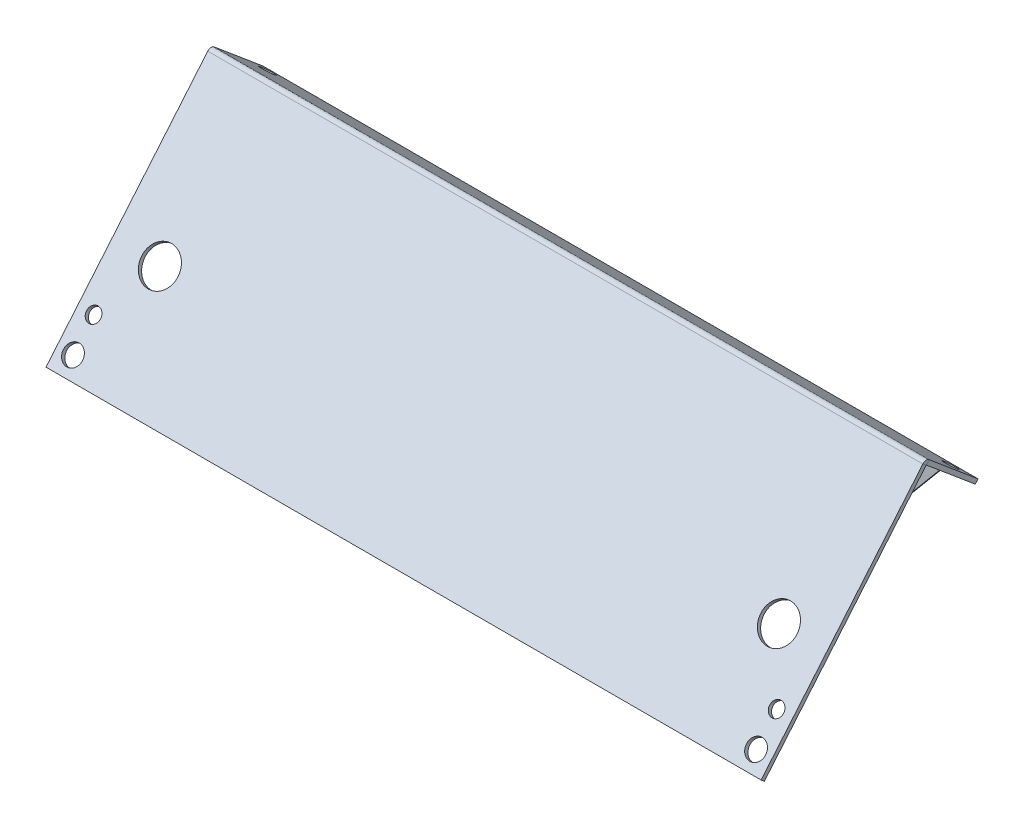
ISO-10303-21;
HEADER;
FILE_DESCRIPTION(('STEP AP214'),'2;1');
FILE_NAME('part.step','',(''),(''),'','','');
FILE_SCHEMA(('AUTOMOTIVE_DESIGN { 1 0 10303 214 1 1 1 1 }'));
ENDSEC;
DATA;
#1=APPLICATION_CONTEXT('core data for automotive mechanical design processes');
#2=APPLICATION_PROTOCOL_DEFINITION('international standard','automotive_design',2000,#1);
#3=PRODUCT_CONTEXT('',#1,'mechanical');
#4=PRODUCT('Part','Part','',(#3));
#5=PRODUCT_RELATED_PRODUCT_CATEGORY('part','',(#4));
#6=PRODUCT_DEFINITION_FORMATION('','',#4);
#7=PRODUCT_DEFINITION_CONTEXT('part definition',#1,'design');
#8=PRODUCT_DEFINITION('design','',#6,#7);
#9=PRODUCT_DEFINITION_SHAPE('','',#8);
#10=(LENGTH_UNIT() NAMED_UNIT(*) SI_UNIT(.MILLI.,.METRE.));
#11=(NAMED_UNIT(*) PLANE_ANGLE_UNIT() SI_UNIT($,.RADIAN.));
#12=(NAMED_UNIT(*) SI_UNIT($,.STERADIAN.) SOLID_ANGLE_UNIT());
#13=UNCERTAINTY_MEASURE_WITH_UNIT(LENGTH_MEASURE(1.E-05),#10,'distance_accuracy_value','');
#14=(GEOMETRIC_REPRESENTATION_CONTEXT(3) GLOBAL_UNCERTAINTY_ASSIGNED_CONTEXT((#13)) GLOBAL_UNIT_ASSIGNED_CONTEXT((#10,
#11,#12)) REPRESENTATION_CONTEXT('',''));
#15=CARTESIAN_POINT('',(0.,0.,0.));
#16=DIRECTION('',(0.,0.,1.));
#17=DIRECTION('',(1.,0.,0.));
#18=AXIS2_PLACEMENT_3D('',#15,#16,#17);
#19=CARTESIAN_POINT('',(-167.5,16.,2.));
#20=DIRECTION('',(0.,0.,-1.));
#21=DIRECTION('',(-1.,0.,0.));
#22=AXIS2_PLACEMENT_3D('',#19,#20,#21);
#23=PLANE('',#22);
#24=CARTESIAN_POINT('',(105.,-5.99999999999999,2.));
#25=DIRECTION('',(0.,0.,-1.));
#26=DIRECTION('',(-1.,0.,0.));
#27=AXIS2_PLACEMENT_3D('',#24,#25,#26);
#28=CIRCLE('',#27,3.);
#29=CARTESIAN_POINT('',(102.,-5.99999999999999,2.));
#30=VERTEX_POINT('',#29);
#31=EDGE_CURVE('E226',#30,#30,#28,.T.);
#32=ORIENTED_EDGE('',*,*,#31,.T.);
#33=EDGE_LOOP('',(#32));
#34=FACE_BOUND('',#33,.T.);
#35=CARTESIAN_POINT('',(35.,-5.99999999999999,2.));
#36=DIRECTION('',(0.,0.,-1.));
#37=DIRECTION('',(-1.,0.,0.));
#38=AXIS2_PLACEMENT_3D('',#35,#36,#37);
#39=CIRCLE('',#38,3.);
#40=CARTESIAN_POINT('',(32.,-5.99999999999999,2.));
#41=VERTEX_POINT('',#40);
#42=EDGE_CURVE('E220',#41,#41,#39,.T.);
#43=ORIENTED_EDGE('',*,*,#42,.T.);
#44=EDGE_LOOP('',(#43));
#45=FACE_BOUND('',#44,.T.);
#46=CARTESIAN_POINT('',(-35.,-5.99999999999999,2.));
#47=DIRECTION('',(0.,0.,-1.));
#48=DIRECTION('',(-1.,0.,0.));
#49=AXIS2_PLACEMENT_3D('',#46,#47,#48);
#50=CIRCLE('',#49,3.);
#51=CARTESIAN_POINT('',(-38.,-5.99999999999999,2.));
#52=VERTEX_POINT('',#51);
#53=EDGE_CURVE('E214',#52,#52,#50,.T.);
#54=ORIENTED_EDGE('',*,*,#53,.T.);
#55=EDGE_LOOP('',(#54));
#56=FACE_BOUND('',#55,.T.);
#57=CARTESIAN_POINT('',(-105.,-5.99999999999999,2.));
#58=DIRECTION('',(0.,0.,-1.));
#59=DIRECTION('',(-1.,0.,0.));
#60=AXIS2_PLACEMENT_3D('',#57,#58,#59);
#61=CIRCLE('',#60,3.);
#62=CARTESIAN_POINT('',(-108.,-5.99999999999999,2.));
#63=VERTEX_POINT('',#62);
#64=EDGE_CURVE('E208',#63,#63,#61,.T.);
#65=ORIENTED_EDGE('',*,*,#64,.T.);
#66=EDGE_LOOP('',(#65));
#67=FACE_BOUND('',#66,.T.);
#68=DIRECTION('',(-0.642787609686543,0.766044443118974,0.));
#69=VECTOR('',#68,1.);
#70=CARTESIAN_POINT('',(-153.,16.0299736784964,2.));
#71=LINE('',#70,#69);
#72=CARTESIAN_POINT('',(-126.123660899755,-16.,2.));
#73=VERTEX_POINT('',#72);
#74=CARTESIAN_POINT('',(-152.935721239031,15.9533692341845,2.));
#75=VERTEX_POINT('',#74);
#76=EDGE_CURVE('E746',#73,#75,#71,.T.);
#77=ORIENTED_EDGE('',*,*,#76,.F.);
#78=DIRECTION('',(1.,0.,0.));
#79=VECTOR('',#78,1.);
#80=CARTESIAN_POINT('',(-167.5,-16.,2.));
#81=LINE('',#80,#79);
#82=CARTESIAN_POINT('',(126.123660899755,-16.,2.));
#83=VERTEX_POINT('',#82);
#84=EDGE_CURVE('E14',#73,#83,#81,.T.);
#85=ORIENTED_EDGE('',*,*,#84,.T.);
#86=DIRECTION('',(0.642787609686543,0.766044443118974,0.));
#87=VECTOR('',#86,1.);
#88=CARTESIAN_POINT('',(153.,16.0299736784964,2.));
#89=LINE('',#88,#87);
#90=CARTESIAN_POINT('',(152.935721239031,15.9533692341845,2.));
#91=VERTEX_POINT('',#90);
#92=EDGE_CURVE('E754',#83,#91,#89,.T.);
#93=ORIENTED_EDGE('',*,*,#92,.T.);
#94=DIRECTION('',(-1.,0.,0.));
#95=VECTOR('',#94,1.);
#96=CARTESIAN_POINT('',(-167.5,15.9533692341845,2.));
#97=LINE('',#96,#95);
#98=EDGE_CURVE('E199',#75,#91,#97,.F.);
#99=ORIENTED_EDGE('',*,*,#98,.F.);
#100=EDGE_LOOP('',(#77,#85,#93,#99));
#101=FACE_BOUND('',#100,.T.);
#102=ADVANCED_FACE('F52',(#34,#45,#56,#67,#101),#23,.F.);
#103=CARTESIAN_POINT('',(-167.5,16.,0.));
#104=DIRECTION('',(0.,0.,-1.));
#105=DIRECTION('',(-1.,0.,0.));
#106=AXIS2_PLACEMENT_3D('',#103,#104,#105);
#107=PLANE('',#106);
#108=CARTESIAN_POINT('',(-105.,-5.99999999999999,0.));
#109=DIRECTION('',(0.,0.,-1.));
#110=DIRECTION('',(-1.,0.,0.));
#111=AXIS2_PLACEMENT_3D('',#108,#109,#110);
#112=CIRCLE('',#111,3.);
#113=CARTESIAN_POINT('',(-108.,-5.99999999999999,0.));
#114=VERTEX_POINT('',#113);
#115=EDGE_CURVE('E204',#114,#114,#112,.T.);
#116=ORIENTED_EDGE('',*,*,#115,.F.);
#117=EDGE_LOOP('',(#116));
#118=FACE_BOUND('',#117,.T.);
#119=CARTESIAN_POINT('',(-35.,-5.99999999999999,0.));
#120=DIRECTION('',(0.,0.,-1.));
#121=DIRECTION('',(-1.,0.,0.));
#122=AXIS2_PLACEMENT_3D('',#119,#120,#121);
#123=CIRCLE('',#122,3.);
#124=CARTESIAN_POINT('',(-38.,-5.99999999999999,0.));
#125=VERTEX_POINT('',#124);
#126=EDGE_CURVE('E211',#125,#125,#123,.T.);
#127=ORIENTED_EDGE('',*,*,#126,.F.);
#128=EDGE_LOOP('',(#127));
#129=FACE_BOUND('',#128,.T.);
#130=CARTESIAN_POINT('',(35.,-5.99999999999999,0.));
#131=DIRECTION('',(0.,0.,-1.));
#132=DIRECTION('',(-1.,0.,0.));
#133=AXIS2_PLACEMENT_3D('',#130,#131,#132);
#134=CIRCLE('',#133,3.);
#135=CARTESIAN_POINT('',(32.,-5.99999999999999,0.));
#136=VERTEX_POINT('',#135);
#137=EDGE_CURVE('E217',#136,#136,#134,.T.);
#138=ORIENTED_EDGE('',*,*,#137,.F.);
#139=EDGE_LOOP('',(#138));
#140=FACE_BOUND('',#139,.T.);
#141=CARTESIAN_POINT('',(105.,-5.99999999999999,0.));
#142=DIRECTION('',(0.,0.,-1.));
#143=DIRECTION('',(-1.,0.,0.));
#144=AXIS2_PLACEMENT_3D('',#141,#142,#143);
#145=CIRCLE('',#144,3.);
#146=CARTESIAN_POINT('',(102.,-5.99999999999999,0.));
#147=VERTEX_POINT('',#146);
#148=EDGE_CURVE('E223',#147,#147,#145,.T.);
#149=ORIENTED_EDGE('',*,*,#148,.F.);
#150=EDGE_LOOP('',(#149));
#151=FACE_BOUND('',#150,.T.);
#152=DIRECTION('',(1.,0.,0.));
#153=VECTOR('',#152,1.);
#154=CARTESIAN_POINT('',(-167.5,-16.,0.));
#155=LINE('',#154,#153);
#156=CARTESIAN_POINT('',(-126.123660899755,-16.,0.));
#157=VERTEX_POINT('',#156);
#158=CARTESIAN_POINT('',(126.123660899755,-16.,0.));
#159=VERTEX_POINT('',#158);
#160=EDGE_CURVE('E61',#157,#159,#155,.T.);
#161=ORIENTED_EDGE('',*,*,#160,.F.);
#162=DIRECTION('',(-0.642787609686543,0.766044443118974,0.));
#163=VECTOR('',#162,1.);
#164=CARTESIAN_POINT('',(-153.,16.0299736784964,0.));
#165=LINE('',#164,#163);
#166=CARTESIAN_POINT('',(-152.935721239031,15.9533692341845,0.));
#167=VERTEX_POINT('',#166);
#168=EDGE_CURVE('E175',#157,#167,#165,.T.);
#169=ORIENTED_EDGE('',*,*,#168,.T.);
#170=DIRECTION('',(-1.,0.,0.));
#171=VECTOR('',#170,1.);
#172=CARTESIAN_POINT('',(-167.5,15.9533692341845,0.));
#173=LINE('',#172,#171);
#174=CARTESIAN_POINT('',(152.935721239031,15.9533692341845,0.));
#175=VERTEX_POINT('',#174);
#176=EDGE_CURVE('E174',#167,#175,#173,.F.);
#177=ORIENTED_EDGE('',*,*,#176,.T.);
#178=DIRECTION('',(0.642787609686543,0.766044443118974,0.));
#179=VECTOR('',#178,1.);
#180=CARTESIAN_POINT('',(153.,16.0299736784964,0.));
#181=LINE('',#180,#179);
#182=EDGE_CURVE('E751',#159,#175,#181,.T.);
#183=ORIENTED_EDGE('',*,*,#182,.F.);
#184=EDGE_LOOP('',(#161,#169,#177,#183));
#185=FACE_BOUND('',#184,.T.);
#186=ADVANCED_FACE('F357',(#118,#129,#140,#151,#185),#107,.T.);
#187=CARTESIAN_POINT('',(-167.5,-16.,2.));
#188=DIRECTION('',(0.,1.,0.));
#189=DIRECTION('',(0.,0.,1.));
#190=AXIS2_PLACEMENT_3D('',#187,#188,#189);
#191=PLANE('',#190);
#192=DIRECTION('',(0.,0.,-1.));
#193=VECTOR('',#192,1.);
#194=CARTESIAN_POINT('',(-126.123660899755,-16.,0.));
#195=LINE('',#194,#193);
#196=EDGE_CURVE('E740',#157,#73,#195,.F.);
#197=ORIENTED_EDGE('',*,*,#196,.F.);
#198=ORIENTED_EDGE('',*,*,#160,.T.);
#199=DIRECTION('',(0.,0.,-1.));
#200=VECTOR('',#199,1.);
#201=CARTESIAN_POINT('',(126.123660899755,-16.,0.));
#202=LINE('',#201,#200);
#203=EDGE_CURVE('E758',#159,#83,#202,.F.);
#204=ORIENTED_EDGE('',*,*,#203,.T.);
#205=ORIENTED_EDGE('',*,*,#84,.F.);
#206=EDGE_LOOP('',(#197,#198,#204,#205));
#207=FACE_BOUND('',#206,.T.);
#208=ADVANCED_FACE('F54',(#207),#191,.F.);
#209=CARTESIAN_POINT('',(-167.5,15.9533692341845,2.1));
#210=DIRECTION('',(-1.,0.,0.));
#211=DIRECTION('',(0.,0.766044443118974,-0.642787609686543));
#212=AXIS2_PLACEMENT_3D('',#209,#210,#211);
#213=CYLINDRICAL_SURFACE('',#212,2.1);
#214=ORIENTED_EDGE('',*,*,#176,.F.);
#215=CARTESIAN_POINT('',(-152.935721239031,15.9533692341845,2.1));
#216=DIRECTION('',(-0.999202668689739,-0.0399252662270862,0.));
#217=DIRECTION('',(-0.0399252662270862,0.999202668689739,0.));
#218=AXIS2_PLACEMENT_3D('',#215,#216,#217);
#219=ELLIPSE('',#218,2.10167573186503,2.1);
#220=CARTESIAN_POINT('',(-153.,17.5620625647344,0.75014601965826));
#221=VERTEX_POINT('',#220);
#222=EDGE_CURVE('E158',#167,#221,#219,.F.);
#223=ORIENTED_EDGE('',*,*,#222,.T.);
#224=DIRECTION('',(1.,0.,0.));
#225=VECTOR('',#224,1.);
#226=CARTESIAN_POINT('',(0.,17.5620625647344,0.750146019658253));
#227=LINE('',#226,#225);
#228=CARTESIAN_POINT('',(153.,17.5620625647344,0.750146019658247));
#229=VERTEX_POINT('',#228);
#230=EDGE_CURVE('E172',#221,#229,#227,.T.);
#231=ORIENTED_EDGE('',*,*,#230,.T.);
#232=CARTESIAN_POINT('',(152.935721239031,15.9533692341845,2.1));
#233=DIRECTION('',(-0.999202668689749,0.0399252662268225,0.));
#234=DIRECTION('',(-0.0399252662268225,-0.999202668689749,0.));
#235=AXIS2_PLACEMENT_3D('',#232,#233,#234);
#236=ELLIPSE('',#235,2.10167573186501,2.1);
#237=EDGE_CURVE('E755',#175,#229,#236,.F.);
#238=ORIENTED_EDGE('',*,*,#237,.F.);
#239=EDGE_LOOP('',(#214,#223,#231,#238));
#240=FACE_BOUND('',#239,.T.);
#241=ADVANCED_FACE('F169',(#240),#213,.T.);
#242=CARTESIAN_POINT('',(-167.5,15.9533692341845,2.1));
#243=DIRECTION('',(-1.,0.,0.));
#244=DIRECTION('',(0.,0.766044443118974,-0.642787609686543));
#245=AXIS2_PLACEMENT_3D('',#242,#243,#244);
#246=CYLINDRICAL_SURFACE('',#245,0.100000000000001);
#247=CARTESIAN_POINT('',(-152.935721239031,15.9533692341845,2.1));
#248=DIRECTION('',(-0.766044443118974,-0.642787609686543,0.));
#249=DIRECTION('',(-0.642787609686544,0.766044443118975,0.));
#250=AXIS2_PLACEMENT_3D('',#247,#248,#249);
#251=ELLIPSE('',#250,0.13054072893323,0.100000000000001);
#252=CARTESIAN_POINT('',(-153.,16.0299736784964,2.03572123903135));
#253=VERTEX_POINT('',#252);
#254=EDGE_CURVE('E69',#75,#253,#251,.F.);
#255=ORIENTED_EDGE('',*,*,#254,.F.);
#256=ORIENTED_EDGE('',*,*,#98,.T.);
#257=CARTESIAN_POINT('',(152.935721239031,15.9533692341845,2.1));
#258=DIRECTION('',(-0.766044443118974,0.642787609686543,0.));
#259=DIRECTION('',(-0.642787609686544,-0.766044443118975,0.));
#260=AXIS2_PLACEMENT_3D('',#257,#258,#259);
#261=ELLIPSE('',#260,0.13054072893323,0.100000000000001);
#262=CARTESIAN_POINT('',(153.,16.0299736784964,2.03572123903135));
#263=VERTEX_POINT('',#262);
#264=EDGE_CURVE('E760',#91,#263,#261,.F.);
#265=ORIENTED_EDGE('',*,*,#264,.T.);
#266=DIRECTION('',(-1.,0.,0.));
#267=VECTOR('',#266,1.);
#268=CARTESIAN_POINT('',(167.5,16.0299736784964,2.03572123903135));
#269=LINE('',#268,#267);
#270=EDGE_CURVE('E298',#263,#253,#269,.T.);
#271=ORIENTED_EDGE('',*,*,#270,.T.);
#272=EDGE_LOOP('',(#255,#256,#265,#271));
#273=FACE_BOUND('',#272,.T.);
#274=ADVANCED_FACE('F383',(#273),#246,.F.);
#275=CARTESIAN_POINT('',(-167.5,36.8157171768343,23.6957580741961));
#276=DIRECTION('',(1.,0.,0.));
#277=DIRECTION('',(0.,0.,-1.));
#278=AXIS2_PLACEMENT_3D('',#275,#276,#277);
#279=PLANE('',#278);
#280=DIRECTION('',(0.,0.766044443118963,-0.642787609686557));
#281=VECTOR('',#280,1.);
#282=CARTESIAN_POINT('',(-167.5,35.2193495296276,24.9047288492573));
#283=LINE('',#282,#281);
#284=CARTESIAN_POINT('',(-167.5,35.2193495296277,24.9047288492573));
#285=VERTEX_POINT('',#284);
#286=CARTESIAN_POINT('',(-167.5,36.7514384158656,23.6191536298842));
#287=VERTEX_POINT('',#286);
#288=EDGE_CURVE('E283',#285,#287,#283,.T.);
#289=ORIENTED_EDGE('',*,*,#288,.T.);
#290=DIRECTION('',(0.,0.642787609686543,0.766044443118974));
#291=VECTOR('',#290,1.);
#292=CARTESIAN_POINT('',(-167.5,36.8157171768343,23.6957580741961));
#293=LINE('',#292,#291);
#294=CARTESIAN_POINT('',(-167.5,17.5620625647344,0.750146019658235));
#295=VERTEX_POINT('',#294);
#296=EDGE_CURVE('E194',#295,#287,#293,.T.);
#297=ORIENTED_EDGE('',*,*,#296,.F.);
#298=DIRECTION('',(0.,0.766044443118975,-0.642787609686543));
#299=VECTOR('',#298,1.);
#300=CARTESIAN_POINT('',(-167.5,16.0299736784964,2.03572123903135));
#301=LINE('',#300,#299);
#302=CARTESIAN_POINT('',(-167.5,16.0299736784964,2.03572123903134));
#303=VERTEX_POINT('',#302);
#304=EDGE_CURVE('E181',#303,#295,#301,.T.);
#305=ORIENTED_EDGE('',*,*,#304,.F.);
#306=DIRECTION('',(0.,0.642787609686543,0.766044443118974));
#307=VECTOR('',#306,1.);
#308=CARTESIAN_POINT('',(-167.5,35.2836282905963,24.9813332935692));
#309=LINE('',#308,#307);
#310=EDGE_CURVE('E184',#303,#285,#309,.T.);
#311=ORIENTED_EDGE('',*,*,#310,.T.);
#312=EDGE_LOOP('',(#289,#297,#305,#311));
#313=FACE_BOUND('',#312,.T.);
#314=ADVANCED_FACE('F386',(#313),#279,.F.);
#315=CARTESIAN_POINT('',(167.5,17.532088886238,0.714424780626912));
#316=DIRECTION('',(-1.,0.,0.));
#317=DIRECTION('',(0.,0.,1.));
#318=AXIS2_PLACEMENT_3D('',#315,#316,#317);
#319=PLANE('',#318);
#320=DIRECTION('',(0.,0.766044443118963,-0.642787609686557));
#321=VECTOR('',#320,1.);
#322=CARTESIAN_POINT('',(167.5,35.2193495296276,24.9047288492573));
#323=LINE('',#322,#321);
#324=CARTESIAN_POINT('',(167.5,35.2193495296276,24.9047288492573));
#325=VERTEX_POINT('',#324);
#326=CARTESIAN_POINT('',(167.5,36.7514384158656,23.6191536298842));
#327=VERTEX_POINT('',#326);
#328=EDGE_CURVE('E292',#325,#327,#323,.T.);
#329=ORIENTED_EDGE('',*,*,#328,.F.);
#330=DIRECTION('',(0.,-0.642787609686543,-0.766044443118974));
#331=VECTOR('',#330,1.);
#332=CARTESIAN_POINT('',(167.5,16.,2.));
#333=LINE('',#332,#331);
#334=CARTESIAN_POINT('',(167.5,16.0299736784964,2.03572123903135));
#335=VERTEX_POINT('',#334);
#336=EDGE_CURVE('E197',#325,#335,#333,.T.);
#337=ORIENTED_EDGE('',*,*,#336,.T.);
#338=DIRECTION('',(0.,0.766044443118975,-0.642787609686543));
#339=VECTOR('',#338,1.);
#340=CARTESIAN_POINT('',(167.5,16.0299736784964,2.03572123903135));
#341=LINE('',#340,#339);
#342=CARTESIAN_POINT('',(167.5,17.5620625647344,0.750146019658247));
#343=VERTEX_POINT('',#342);
#344=EDGE_CURVE('E193',#335,#343,#341,.T.);
#345=ORIENTED_EDGE('',*,*,#344,.T.);
#346=DIRECTION('',(0.,-0.642787609686543,-0.766044443118974));
#347=VECTOR('',#346,1.);
#348=CARTESIAN_POINT('',(167.5,17.532088886238,0.714424780626912));
#349=LINE('',#348,#347);
#350=EDGE_CURVE('E196',#327,#343,#349,.T.);
#351=ORIENTED_EDGE('',*,*,#350,.F.);
#352=EDGE_LOOP('',(#329,#337,#345,#351));
#353=FACE_BOUND('',#352,.T.);
#354=ADVANCED_FACE('F307',(#353),#319,.F.);
#355=CARTESIAN_POINT('',(0.,9.93646655456111,-8.3376854211377));
#356=DIRECTION('',(0.,-0.766044443118975,0.642787609686544));
#357=DIRECTION('',(0.,-0.642787609686543,-0.766044443118974));
#358=AXIS2_PLACEMENT_3D('',#355,#356,#357);
#359=PLANE('',#358);
#360=CARTESIAN_POINT('',(-160.,22.0316021540438,6.07673588245973));
#361=DIRECTION('',(0.,0.766044443118975,-0.642787609686543));
#362=DIRECTION('',(0.,0.642787609686543,0.766044443118975));
#363=AXIS2_PLACEMENT_3D('',#360,#361,#362);
#364=CIRCLE('',#363,3.3);
#365=CARTESIAN_POINT('',(-160.,24.1528012660094,8.60468254475234));
#366=VERTEX_POINT('',#365);
#367=EDGE_CURVE('E239',#366,#366,#364,.T.);
#368=ORIENTED_EDGE('',*,*,#367,.F.);
#369=EDGE_LOOP('',(#368));
#370=FACE_BOUND('',#369,.T.);
#371=CARTESIAN_POINT('',(160.,22.0316021540438,6.07673588245973));
#372=DIRECTION('',(0.,0.766044443118975,-0.642787609686543));
#373=DIRECTION('',(0.,0.642787609686543,0.766044443118975));
#374=AXIS2_PLACEMENT_3D('',#371,#372,#373);
#375=CIRCLE('',#374,3.3);
#376=CARTESIAN_POINT('',(160.,24.1528012660094,8.60468254475234));
#377=VERTEX_POINT('',#376);
#378=EDGE_CURVE('E230',#377,#377,#375,.T.);
#379=ORIENTED_EDGE('',*,*,#378,.F.);
#380=EDGE_LOOP('',(#379));
#381=FACE_BOUND('',#380,.T.);
#382=DIRECTION('',(-1.,0.,0.));
#383=VECTOR('',#382,1.);
#384=CARTESIAN_POINT('',(-167.5,36.7514384158656,23.6191536298842));
#385=LINE('',#384,#383);
#386=EDGE_CURVE('E277',#287,#327,#385,.F.);
#387=ORIENTED_EDGE('',*,*,#386,.T.);
#388=ORIENTED_EDGE('',*,*,#350,.T.);
#389=DIRECTION('',(1.,0.,0.));
#390=VECTOR('',#389,1.);
#391=CARTESIAN_POINT('',(167.5,17.5620625647344,0.750146019658247));
#392=LINE('',#391,#390);
#393=EDGE_CURVE('E163',#229,#343,#392,.T.);
#394=ORIENTED_EDGE('',*,*,#393,.F.);
#395=ORIENTED_EDGE('',*,*,#230,.F.);
#396=EDGE_CURVE('E178',#295,#221,#227,.T.);
#397=ORIENTED_EDGE('',*,*,#396,.F.);
#398=ORIENTED_EDGE('',*,*,#296,.T.);
#399=EDGE_LOOP('',(#387,#388,#394,#395,#397,#398));
#400=FACE_BOUND('',#399,.T.);
#401=ADVANCED_FACE('F187',(#370,#381,#400),#359,.F.);
#402=CARTESIAN_POINT('',(0.,8.40437766832316,-7.05211020176461));
#403=DIRECTION('',(0.,-0.766044443118975,0.642787609686544));
#404=DIRECTION('',(0.,-0.642787609686543,-0.766044443118974));
#405=AXIS2_PLACEMENT_3D('',#402,#403,#404);
#406=PLANE('',#405);
#407=CARTESIAN_POINT('',(-160.,20.4995132678058,7.36231110183281));
#408=DIRECTION('',(0.,-0.766044443118975,0.642787609686544));
#409=DIRECTION('',(0.,-0.642787609686543,-0.766044443118974));
#410=AXIS2_PLACEMENT_3D('',#407,#408,#409);
#411=CIRCLE('',#410,3.29999999999998);
#412=CARTESIAN_POINT('',(-160.,18.3783141558402,4.83436443954021));
#413=VERTEX_POINT('',#412);
#414=EDGE_CURVE('E234',#413,#413,#411,.T.);
#415=ORIENTED_EDGE('',*,*,#414,.F.);
#416=EDGE_LOOP('',(#415));
#417=FACE_BOUND('',#416,.T.);
#418=CARTESIAN_POINT('',(160.,20.4995132678058,7.36231110183281));
#419=DIRECTION('',(0.,-0.766044443118975,0.642787609686544));
#420=DIRECTION('',(0.,-0.642787609686543,-0.766044443118974));
#421=AXIS2_PLACEMENT_3D('',#418,#419,#420);
#422=CIRCLE('',#421,3.29999999999998);
#423=CARTESIAN_POINT('',(160.,18.3783141558402,4.83436443954021));
#424=VERTEX_POINT('',#423);
#425=EDGE_CURVE('E164',#424,#424,#422,.T.);
#426=ORIENTED_EDGE('',*,*,#425,.F.);
#427=EDGE_LOOP('',(#426));
#428=FACE_BOUND('',#427,.T.);
#429=ORIENTED_EDGE('',*,*,#336,.F.);
#430=DIRECTION('',(-1.,0.,0.));
#431=VECTOR('',#430,1.);
#432=CARTESIAN_POINT('',(-167.5,35.2193495296276,24.9047288492573));
#433=LINE('',#432,#431);
#434=EDGE_CURVE('E77',#285,#325,#433,.F.);
#435=ORIENTED_EDGE('',*,*,#434,.F.);
#436=ORIENTED_EDGE('',*,*,#310,.F.);
#437=EDGE_CURVE('E299',#253,#303,#269,.T.);
#438=ORIENTED_EDGE('',*,*,#437,.F.);
#439=ORIENTED_EDGE('',*,*,#270,.F.);
#440=EDGE_CURVE('E189',#335,#263,#269,.T.);
#441=ORIENTED_EDGE('',*,*,#440,.F.);
#442=EDGE_LOOP('',(#429,#435,#436,#438,#439,#441));
#443=FACE_BOUND('',#442,.T.);
#444=ADVANCED_FACE('F370',(#417,#428,#443),#406,.T.);
#445=CARTESIAN_POINT('',(105.,-5.99999999999999,0.));
#446=DIRECTION('',(0.,0.,-1.));
#447=DIRECTION('',(-1.,0.,0.));
#448=AXIS2_PLACEMENT_3D('',#445,#446,#447);
#449=CYLINDRICAL_SURFACE('',#448,3.);
#450=ORIENTED_EDGE('',*,*,#31,.F.);
#451=EDGE_LOOP('',(#450));
#452=FACE_BOUND('',#451,.T.);
#453=ORIENTED_EDGE('',*,*,#148,.T.);
#454=EDGE_LOOP('',(#453));
#455=FACE_BOUND('',#454,.T.);
#456=ADVANCED_FACE('F366',(#452,#455),#449,.F.);
#457=CARTESIAN_POINT('',(35.,-5.99999999999999,0.));
#458=DIRECTION('',(0.,0.,-1.));
#459=DIRECTION('',(-1.,0.,0.));
#460=AXIS2_PLACEMENT_3D('',#457,#458,#459);
#461=CYLINDRICAL_SURFACE('',#460,3.);
#462=ORIENTED_EDGE('',*,*,#42,.F.);
#463=EDGE_LOOP('',(#462));
#464=FACE_BOUND('',#463,.T.);
#465=ORIENTED_EDGE('',*,*,#137,.T.);
#466=EDGE_LOOP('',(#465));
#467=FACE_BOUND('',#466,.T.);
#468=ADVANCED_FACE('F369',(#464,#467),#461,.F.);
#469=CARTESIAN_POINT('',(-35.,-5.99999999999999,0.));
#470=DIRECTION('',(0.,0.,-1.));
#471=DIRECTION('',(-1.,0.,0.));
#472=AXIS2_PLACEMENT_3D('',#469,#470,#471);
#473=CYLINDRICAL_SURFACE('',#472,3.);
#474=ORIENTED_EDGE('',*,*,#53,.F.);
#475=EDGE_LOOP('',(#474));
#476=FACE_BOUND('',#475,.T.);
#477=ORIENTED_EDGE('',*,*,#126,.T.);
#478=EDGE_LOOP('',(#477));
#479=FACE_BOUND('',#478,.T.);
#480=ADVANCED_FACE('F374',(#476,#479),#473,.F.);
#481=CARTESIAN_POINT('',(-105.,-5.99999999999999,0.));
#482=DIRECTION('',(0.,0.,-1.));
#483=DIRECTION('',(-1.,0.,0.));
#484=AXIS2_PLACEMENT_3D('',#481,#482,#483);
#485=CYLINDRICAL_SURFACE('',#484,3.);
#486=ORIENTED_EDGE('',*,*,#64,.F.);
#487=EDGE_LOOP('',(#486));
#488=FACE_BOUND('',#487,.T.);
#489=ORIENTED_EDGE('',*,*,#115,.T.);
#490=EDGE_LOOP('',(#489));
#491=FACE_BOUND('',#490,.T.);
#492=ADVANCED_FACE('F378',(#488,#491),#485,.F.);
#493=CARTESIAN_POINT('',(167.5,35.1427450853158,24.969007610226));
#494=DIRECTION('',(1.,0.,0.));
#495=DIRECTION('',(0.,0.,-1.));
#496=AXIS2_PLACEMENT_3D('',#493,#494,#495);
#497=PLANE('',#496);
#498=DIRECTION('',(0.,0.642787609686546,0.766044443118972));
#499=VECTOR('',#498,1.);
#500=CARTESIAN_POINT('',(167.5,35.2070238462844,25.0456120545379));
#501=LINE('',#500,#499);
#502=CARTESIAN_POINT('',(167.5,35.2070238462844,25.0456120545379));
#503=VERTEX_POINT('',#502);
#504=CARTESIAN_POINT('',(167.5,36.4925990656575,26.5777009407759));
#505=VERTEX_POINT('',#504);
#506=EDGE_CURVE('E246',#503,#505,#501,.T.);
#507=ORIENTED_EDGE('',*,*,#506,.F.);
#508=CARTESIAN_POINT('',(167.5,35.1427450853158,24.969007610226));
#509=DIRECTION('',(-1.,0.,0.));
#510=DIRECTION('',(0.,0.,1.));
#511=AXIS2_PLACEMENT_3D('',#508,#509,#510);
#512=CIRCLE('',#511,0.0999999999999963);
#513=EDGE_CURVE('E286',#325,#503,#512,.F.);
#514=ORIENTED_EDGE('',*,*,#513,.F.);
#515=ORIENTED_EDGE('',*,*,#328,.T.);
#516=CARTESIAN_POINT('',(167.5,35.1427450853158,24.969007610226));
#517=DIRECTION('',(-1.,0.,0.));
#518=DIRECTION('',(0.,0.,1.));
#519=AXIS2_PLACEMENT_3D('',#516,#517,#518);
#520=CIRCLE('',#519,2.1);
#521=EDGE_CURVE('E279',#327,#505,#520,.F.);
#522=ORIENTED_EDGE('',*,*,#521,.T.);
#523=EDGE_LOOP('',(#507,#514,#515,#522));
#524=FACE_BOUND('',#523,.T.);
#525=ADVANCED_FACE('F337',(#524),#497,.T.);
#526=CARTESIAN_POINT('',(-167.5,35.1427450853158,24.969007610226));
#527=DIRECTION('',(1.,0.,0.));
#528=DIRECTION('',(0.,0.,-1.));
#529=AXIS2_PLACEMENT_3D('',#526,#527,#528);
#530=PLANE('',#529);
#531=CARTESIAN_POINT('',(-167.5,35.1427450853158,24.969007610226));
#532=DIRECTION('',(-1.,0.,0.));
#533=DIRECTION('',(0.,0.,1.));
#534=AXIS2_PLACEMENT_3D('',#531,#532,#533);
#535=CIRCLE('',#534,0.0999999999999963);
#536=CARTESIAN_POINT('',(-167.5,35.2070238462844,25.0456120545379));
#537=VERTEX_POINT('',#536);
#538=EDGE_CURVE('E276',#537,#285,#535,.T.);
#539=ORIENTED_EDGE('',*,*,#538,.F.);
#540=DIRECTION('',(0.,0.642787609686546,0.766044443118972));
#541=VECTOR('',#540,1.);
#542=CARTESIAN_POINT('',(-167.5,35.2070238462844,25.0456120545379));
#543=LINE('',#542,#541);
#544=CARTESIAN_POINT('',(-167.5,36.4925990656575,26.5777009407759));
#545=VERTEX_POINT('',#544);
#546=EDGE_CURVE('E249',#537,#545,#543,.T.);
#547=ORIENTED_EDGE('',*,*,#546,.T.);
#548=CARTESIAN_POINT('',(-167.5,35.1427450853158,24.969007610226));
#549=DIRECTION('',(-1.,0.,0.));
#550=DIRECTION('',(0.,0.,1.));
#551=AXIS2_PLACEMENT_3D('',#548,#549,#550);
#552=CIRCLE('',#551,2.1);
#553=EDGE_CURVE('E280',#545,#287,#552,.T.);
#554=ORIENTED_EDGE('',*,*,#553,.T.);
#555=ORIENTED_EDGE('',*,*,#288,.F.);
#556=EDGE_LOOP('',(#539,#547,#554,#555));
#557=FACE_BOUND('',#556,.T.);
#558=ADVANCED_FACE('F316',(#557),#530,.F.);
#559=CARTESIAN_POINT('',(-167.5,35.1427450853158,24.969007610226));
#560=DIRECTION('',(-1.,0.,0.));
#561=DIRECTION('',(0.,0.642787609686546,0.766044443118972));
#562=AXIS2_PLACEMENT_3D('',#559,#560,#561);
#563=CYLINDRICAL_SURFACE('',#562,2.1);
#564=ORIENTED_EDGE('',*,*,#386,.F.);
#565=ORIENTED_EDGE('',*,*,#553,.F.);
#566=DIRECTION('',(1.,0.,0.));
#567=VECTOR('',#566,1.);
#568=CARTESIAN_POINT('',(0.,36.4925990656575,26.5777009407758));
#569=LINE('',#568,#567);
#570=EDGE_CURVE('E252',#545,#505,#569,.T.);
#571=ORIENTED_EDGE('',*,*,#570,.T.);
#572=ORIENTED_EDGE('',*,*,#521,.F.);
#573=EDGE_LOOP('',(#564,#565,#571,#572));
#574=FACE_BOUND('',#573,.T.);
#575=ADVANCED_FACE('F312',(#574),#563,.T.);
#576=CARTESIAN_POINT('',(-167.5,35.1427450853158,24.969007610226));
#577=DIRECTION('',(-1.,0.,0.));
#578=DIRECTION('',(0.,0.642787609686546,0.766044443118972));
#579=AXIS2_PLACEMENT_3D('',#576,#577,#578);
#580=CYLINDRICAL_SURFACE('',#579,0.0999999999999963);
#581=ORIENTED_EDGE('',*,*,#434,.T.);
#582=ORIENTED_EDGE('',*,*,#513,.T.);
#583=DIRECTION('',(-1.,0.,0.));
#584=VECTOR('',#583,1.);
#585=CARTESIAN_POINT('',(167.5,35.2070238462844,25.0456120545379));
#586=LINE('',#585,#584);
#587=EDGE_CURVE('E247',#503,#537,#586,.T.);
#588=ORIENTED_EDGE('',*,*,#587,.T.);
#589=ORIENTED_EDGE('',*,*,#538,.T.);
#590=EDGE_LOOP('',(#581,#582,#588,#589));
#591=FACE_BOUND('',#590,.T.);
#592=ADVANCED_FACE('F340',(#591),#580,.F.);
#593=CARTESIAN_POINT('',(-167.5,-53.8240407780693,102.36236012282));
#594=DIRECTION('',(1.,0.,0.));
#595=DIRECTION('',(0.,1.,0.));
#596=AXIS2_PLACEMENT_3D('',#593,#594,#595);
#597=PLANE('',#596);
#598=ORIENTED_EDGE('',*,*,#546,.F.);
#599=DIRECTION('',(0.,-0.766044443118972,0.642787609686546));
#600=VECTOR('',#599,1.);
#601=CARTESIAN_POINT('',(-167.5,-55.1096159974424,100.830271236582));
#602=LINE('',#601,#600);
#603=CARTESIAN_POINT('',(-167.5,-55.1096159974424,100.830271236582));
#604=VERTEX_POINT('',#603);
#605=EDGE_CURVE('E256',#537,#604,#602,.T.);
#606=ORIENTED_EDGE('',*,*,#605,.T.);
#607=DIRECTION('',(0.,-0.642787609686546,-0.766044443118972));
#608=VECTOR('',#607,1.);
#609=CARTESIAN_POINT('',(-167.5,-53.8240407780693,102.36236012282));
#610=LINE('',#609,#608);
#611=CARTESIAN_POINT('',(-167.5,-53.8240407780693,102.36236012282));
#612=VERTEX_POINT('',#611);
#613=EDGE_CURVE('E273',#612,#604,#610,.T.);
#614=ORIENTED_EDGE('',*,*,#613,.F.);
#615=DIRECTION('',(0.,-0.766044443118972,0.642787609686546));
#616=VECTOR('',#615,1.);
#617=CARTESIAN_POINT('',(-167.5,-53.8240407780693,102.36236012282));
#618=LINE('',#617,#616);
#619=EDGE_CURVE('E257',#545,#612,#618,.T.);
#620=ORIENTED_EDGE('',*,*,#619,.F.);
#621=EDGE_LOOP('',(#598,#606,#614,#620));
#622=FACE_BOUND('',#621,.T.);
#623=ADVANCED_FACE('F326',(#622),#597,.F.);
#624=CARTESIAN_POINT('',(167.5,36.5692035099694,26.5134221798072));
#625=DIRECTION('',(-1.,0.,0.));
#626=DIRECTION('',(0.,0.,1.));
#627=AXIS2_PLACEMENT_3D('',#624,#625,#626);
#628=PLANE('',#627);
#629=ORIENTED_EDGE('',*,*,#506,.T.);
#630=DIRECTION('',(0.,0.766044443118972,-0.642787609686546));
#631=VECTOR('',#630,1.);
#632=CARTESIAN_POINT('',(167.5,36.5692035099694,26.5134221798072));
#633=LINE('',#632,#631);
#634=CARTESIAN_POINT('',(167.5,-53.8240407780693,102.36236012282));
#635=VERTEX_POINT('',#634);
#636=EDGE_CURVE('E262',#635,#505,#633,.T.);
#637=ORIENTED_EDGE('',*,*,#636,.F.);
#638=DIRECTION('',(0.,-0.642787609686546,-0.766044443118972));
#639=VECTOR('',#638,1.);
#640=CARTESIAN_POINT('',(167.5,-53.8240407780693,102.36236012282));
#641=LINE('',#640,#639);
#642=CARTESIAN_POINT('',(167.5,-55.1096159974424,100.830271236582));
#643=VERTEX_POINT('',#642);
#644=EDGE_CURVE('E265',#635,#643,#641,.T.);
#645=ORIENTED_EDGE('',*,*,#644,.T.);
#646=DIRECTION('',(0.,0.766044443118972,-0.642787609686546));
#647=VECTOR('',#646,1.);
#648=CARTESIAN_POINT('',(167.5,35.2836282905963,24.9813332935692));
#649=LINE('',#648,#647);
#650=EDGE_CURVE('E260',#643,#503,#649,.T.);
#651=ORIENTED_EDGE('',*,*,#650,.T.);
#652=EDGE_LOOP('',(#629,#637,#645,#651));
#653=FACE_BOUND('',#652,.T.);
#654=ADVANCED_FACE('F334',(#653),#628,.F.);
#655=CARTESIAN_POINT('',(0.,28.1648258416464,33.5655323815717));
#656=DIRECTION('',(0.,-0.642787609686546,-0.766044443118972));
#657=DIRECTION('',(0.,0.766044443118972,-0.642787609686546));
#658=AXIS2_PLACEMENT_3D('',#655,#656,#657);
#659=PLANE('',#658);
#660=CARTESIAN_POINT('',(-160.,-47.6956852331177,97.2200592453274));
#661=DIRECTION('',(0.,0.642787609686546,0.766044443118972));
#662=DIRECTION('',(0.,-0.766044443118972,0.642787609686546));
#663=AXIS2_PLACEMENT_3D('',#660,#661,#662);
#664=CIRCLE('',#663,4.5);
#665=CARTESIAN_POINT('',(-160.,-51.1428852271531,100.112603488917));
#666=VERTEX_POINT('',#665);
#667=EDGE_CURVE('E822',#666,#666,#664,.T.);
#668=ORIENTED_EDGE('',*,*,#667,.F.);
#669=EDGE_LOOP('',(#668));
#670=FACE_BOUND('',#669,.T.);
#671=CARTESIAN_POINT('',(160.,-47.6956852331177,97.2200592453274));
#672=DIRECTION('',(0.,0.642787609686546,0.766044443118972));
#673=DIRECTION('',(0.,-0.766044443118972,0.642787609686546));
#674=AXIS2_PLACEMENT_3D('',#671,#672,#673);
#675=CIRCLE('',#674,4.5);
#676=CARTESIAN_POINT('',(160.,-51.1428852271531,100.112603488917));
#677=VERTEX_POINT('',#676);
#678=EDGE_CURVE('E817',#677,#677,#675,.T.);
#679=ORIENTED_EDGE('',*,*,#678,.F.);
#680=EDGE_LOOP('',(#679));
#681=FACE_BOUND('',#680,.T.);
#682=CARTESIAN_POINT('',(-145.,-17.0539075083588,71.5085548578656));
#683=DIRECTION('',(0.,0.642787609686546,0.766044443118972));
#684=DIRECTION('',(0.,-0.766044443118972,0.642787609686546));
#685=AXIS2_PLACEMENT_3D('',#682,#683,#684);
#686=CIRCLE('',#685,8.50000000000001);
#687=CARTESIAN_POINT('',(-145.,-23.5652852748701,76.9722495402012));
#688=VERTEX_POINT('',#687);
#689=EDGE_CURVE('E811',#688,#688,#686,.T.);
#690=ORIENTED_EDGE('',*,*,#689,.F.);
#691=EDGE_LOOP('',(#690));
#692=FACE_BOUND('',#691,.T.);
#693=CARTESIAN_POINT('',(145.,-17.0539075083588,71.5085548578656));
#694=DIRECTION('',(0.,0.642787609686546,0.766044443118972));
#695=DIRECTION('',(0.,-0.766044443118972,0.642787609686546));
#696=AXIS2_PLACEMENT_3D('',#693,#694,#695);
#697=CIRCLE('',#696,8.50000000000001);
#698=CARTESIAN_POINT('',(145.,-23.5652852748701,76.9722495402012));
#699=VERTEX_POINT('',#698);
#700=EDGE_CURVE('E801',#699,#699,#697,.T.);
#701=ORIENTED_EDGE('',*,*,#700,.F.);
#702=EDGE_LOOP('',(#701));
#703=FACE_BOUND('',#702,.T.);
#704=CARTESIAN_POINT('',(-160.,-36.2050185863331,87.5782451000292));
#705=DIRECTION('',(0.,0.642787609686546,0.766044443118972));
#706=DIRECTION('',(0.,-0.766044443118972,0.642787609686546));
#707=AXIS2_PLACEMENT_3D('',#704,#705,#706);
#708=CIRCLE('',#707,3.3);
#709=CARTESIAN_POINT('',(-160.,-38.7329652486257,89.6994442119948));
#710=VERTEX_POINT('',#709);
#711=EDGE_CURVE('E766',#710,#710,#708,.T.);
#712=ORIENTED_EDGE('',*,*,#711,.F.);
#713=EDGE_LOOP('',(#712));
#714=FACE_BOUND('',#713,.T.);
#715=CARTESIAN_POINT('',(160.,-36.2050185863331,87.5782451000292));
#716=DIRECTION('',(0.,0.642787609686546,0.766044443118972));
#717=DIRECTION('',(0.,-0.766044443118972,0.642787609686546));
#718=AXIS2_PLACEMENT_3D('',#715,#716,#717);
#719=CIRCLE('',#718,3.3);
#720=CARTESIAN_POINT('',(160.,-38.7329652486257,89.6994442119948));
#721=VERTEX_POINT('',#720);
#722=EDGE_CURVE('E773',#721,#721,#719,.T.);
#723=ORIENTED_EDGE('',*,*,#722,.F.);
#724=EDGE_LOOP('',(#723));
#725=FACE_BOUND('',#724,.T.);
#726=ORIENTED_EDGE('',*,*,#570,.F.);
#727=ORIENTED_EDGE('',*,*,#619,.T.);
#728=DIRECTION('',(1.,0.,0.));
#729=VECTOR('',#728,1.);
#730=CARTESIAN_POINT('',(167.5,-53.8240407780693,102.36236012282));
#731=LINE('',#730,#729);
#732=EDGE_CURVE('E259',#612,#635,#731,.T.);
#733=ORIENTED_EDGE('',*,*,#732,.T.);
#734=ORIENTED_EDGE('',*,*,#636,.T.);
#735=EDGE_LOOP('',(#726,#727,#733,#734));
#736=FACE_BOUND('',#735,.T.);
#737=ADVANCED_FACE('F323',(#670,#681,#692,#703,#714,#725,#736),#659,.F.);
#738=CARTESIAN_POINT('',(0.,26.8792506222733,32.0334434953338));
#739=DIRECTION('',(0.,-0.642787609686546,-0.766044443118972));
#740=DIRECTION('',(0.,0.766044443118972,-0.642787609686546));
#741=AXIS2_PLACEMENT_3D('',#738,#739,#740);
#742=PLANE('',#741);
#743=CARTESIAN_POINT('',(-160.,-48.9812604524908,95.6879703590895));
#744=DIRECTION('',(0.,0.642787609686546,0.766044443118972));
#745=DIRECTION('',(0.,-0.766044443118972,0.642787609686546));
#746=AXIS2_PLACEMENT_3D('',#743,#744,#745);
#747=CIRCLE('',#746,4.5);
#748=CARTESIAN_POINT('',(-160.,-52.4284604465262,98.5805146026789));
#749=VERTEX_POINT('',#748);
#750=EDGE_CURVE('E820',#749,#749,#747,.T.);
#751=ORIENTED_EDGE('',*,*,#750,.T.);
#752=EDGE_LOOP('',(#751));
#753=FACE_BOUND('',#752,.T.);
#754=CARTESIAN_POINT('',(160.,-48.9812604524908,95.6879703590895));
#755=DIRECTION('',(0.,0.642787609686546,0.766044443118972));
#756=DIRECTION('',(0.,-0.766044443118972,0.642787609686546));
#757=AXIS2_PLACEMENT_3D('',#754,#755,#756);
#758=CIRCLE('',#757,4.5);
#759=CARTESIAN_POINT('',(160.,-52.4284604465262,98.5805146026789));
#760=VERTEX_POINT('',#759);
#761=EDGE_CURVE('E814',#760,#760,#758,.T.);
#762=ORIENTED_EDGE('',*,*,#761,.T.);
#763=EDGE_LOOP('',(#762));
#764=FACE_BOUND('',#763,.T.);
#765=CARTESIAN_POINT('',(-145.,-18.3394827277319,69.9764659716276));
#766=DIRECTION('',(0.,0.642787609686546,0.766044443118972));
#767=DIRECTION('',(0.,-0.766044443118972,0.642787609686546));
#768=AXIS2_PLACEMENT_3D('',#765,#766,#767);
#769=CIRCLE('',#768,8.50000000000001);
#770=CARTESIAN_POINT('',(-145.,-24.8508604942432,75.4401606539633));
#771=VERTEX_POINT('',#770);
#772=EDGE_CURVE('E806',#771,#771,#769,.T.);
#773=ORIENTED_EDGE('',*,*,#772,.T.);
#774=EDGE_LOOP('',(#773));
#775=FACE_BOUND('',#774,.T.);
#776=CARTESIAN_POINT('',(145.,-18.3394827277319,69.9764659716276));
#777=DIRECTION('',(0.,0.642787609686546,0.766044443118972));
#778=DIRECTION('',(0.,-0.766044443118972,0.642787609686546));
#779=AXIS2_PLACEMENT_3D('',#776,#777,#778);
#780=CIRCLE('',#779,8.50000000000001);
#781=CARTESIAN_POINT('',(145.,-24.8508604942432,75.4401606539633));
#782=VERTEX_POINT('',#781);
#783=EDGE_CURVE('E799',#782,#782,#780,.T.);
#784=ORIENTED_EDGE('',*,*,#783,.T.);
#785=EDGE_LOOP('',(#784));
#786=FACE_BOUND('',#785,.T.);
#787=CARTESIAN_POINT('',(-160.,-37.4905938057062,86.0461562137913));
#788=DIRECTION('',(0.,-0.642787609686546,-0.766044443118972));
#789=DIRECTION('',(0.,0.766044443118972,-0.642787609686546));
#790=AXIS2_PLACEMENT_3D('',#787,#788,#789);
#791=CIRCLE('',#790,3.3);
#792=CARTESIAN_POINT('',(-160.,-34.9626471434136,83.9249571018257));
#793=VERTEX_POINT('',#792);
#794=EDGE_CURVE('E770',#793,#793,#791,.T.);
#795=ORIENTED_EDGE('',*,*,#794,.F.);
#796=EDGE_LOOP('',(#795));
#797=FACE_BOUND('',#796,.T.);
#798=CARTESIAN_POINT('',(160.,-37.4905938057062,86.0461562137913));
#799=DIRECTION('',(0.,-0.642787609686546,-0.766044443118972));
#800=DIRECTION('',(0.,0.766044443118972,-0.642787609686546));
#801=AXIS2_PLACEMENT_3D('',#798,#799,#800);
#802=CIRCLE('',#801,3.3);
#803=CARTESIAN_POINT('',(160.,-34.9626471434136,83.9249571018257));
#804=VERTEX_POINT('',#803);
#805=EDGE_CURVE('E56',#804,#804,#802,.T.);
#806=ORIENTED_EDGE('',*,*,#805,.F.);
#807=EDGE_LOOP('',(#806));
#808=FACE_BOUND('',#807,.T.);
#809=ORIENTED_EDGE('',*,*,#605,.F.);
#810=ORIENTED_EDGE('',*,*,#587,.F.);
#811=ORIENTED_EDGE('',*,*,#650,.F.);
#812=DIRECTION('',(1.,0.,0.));
#813=VECTOR('',#812,1.);
#814=CARTESIAN_POINT('',(167.5,-55.1096159974424,100.830271236582));
#815=LINE('',#814,#813);
#816=EDGE_CURVE('E267',#604,#643,#815,.T.);
#817=ORIENTED_EDGE('',*,*,#816,.F.);
#818=EDGE_LOOP('',(#809,#810,#811,#817));
#819=FACE_BOUND('',#818,.T.);
#820=ADVANCED_FACE('F342',(#753,#764,#775,#786,#797,#808,#819),#742,.T.);
#821=CARTESIAN_POINT('',(167.5,-53.8240407780693,102.36236012282));
#822=DIRECTION('',(0.,0.766044443118972,-0.642787609686546));
#823=DIRECTION('',(0.,0.642787609686546,0.766044443118972));
#824=AXIS2_PLACEMENT_3D('',#821,#822,#823);
#825=PLANE('',#824);
#826=ORIENTED_EDGE('',*,*,#816,.T.);
#827=ORIENTED_EDGE('',*,*,#644,.F.);
#828=ORIENTED_EDGE('',*,*,#732,.F.);
#829=ORIENTED_EDGE('',*,*,#613,.T.);
#830=EDGE_LOOP('',(#826,#827,#828,#829));
#831=FACE_BOUND('',#830,.T.);
#832=ADVANCED_FACE('F331',(#831),#825,.F.);
#833=CARTESIAN_POINT('',(167.5,-27.6345595792851,38.6746149911643));
#834=DIRECTION('',(0.,0.642787609686543,0.766044443118974));
#835=DIRECTION('',(0.,-0.766044443118975,0.642787609686543));
#836=AXIS2_PLACEMENT_3D('',#833,#834,#835);
#837=PLANE('',#836);
#838=DIRECTION('',(0.,0.766044443118974,-0.642787609686543));
#839=VECTOR('',#838,1.);
#840=CARTESIAN_POINT('',(153.,-27.6345595792851,38.6746149911643));
#841=LINE('',#840,#839);
#842=EDGE_CURVE('E244',#263,#229,#841,.T.);
#843=ORIENTED_EDGE('',*,*,#842,.T.);
#844=ORIENTED_EDGE('',*,*,#393,.T.);
#845=ORIENTED_EDGE('',*,*,#344,.F.);
#846=ORIENTED_EDGE('',*,*,#440,.T.);
#847=EDGE_LOOP('',(#843,#844,#845,#846));
#848=FACE_BOUND('',#847,.T.);
#849=ADVANCED_FACE('F308',(#848),#837,.F.);
#850=CARTESIAN_POINT('',(-167.5,-27.6345595792852,38.6746149911643));
#851=DIRECTION('',(0.,0.642787609686543,0.766044443118974));
#852=DIRECTION('',(0.,-0.766044443118975,0.642787609686543));
#853=AXIS2_PLACEMENT_3D('',#850,#851,#852);
#854=PLANE('',#853);
#855=ORIENTED_EDGE('',*,*,#304,.T.);
#856=ORIENTED_EDGE('',*,*,#396,.T.);
#857=DIRECTION('',(0.,0.766044443118974,-0.642787609686543));
#858=VECTOR('',#857,1.);
#859=CARTESIAN_POINT('',(-153.,-27.6345595792851,38.6746149911643));
#860=LINE('',#859,#858);
#861=EDGE_CURVE('E155',#253,#221,#860,.T.);
#862=ORIENTED_EDGE('',*,*,#861,.F.);
#863=ORIENTED_EDGE('',*,*,#437,.T.);
#864=EDGE_LOOP('',(#855,#856,#862,#863));
#865=FACE_BOUND('',#864,.T.);
#866=ADVANCED_FACE('F179',(#865),#854,.F.);
#867=CARTESIAN_POINT('',(160.,22.0316021540438,6.07673588245973));
#868=DIRECTION('',(0.,0.766044443118975,-0.642787609686543));
#869=DIRECTION('',(0.,0.642787609686543,0.766044443118975));
#870=AXIS2_PLACEMENT_3D('',#867,#868,#869);
#871=CYLINDRICAL_SURFACE('',#870,3.29999999999998);
#872=ORIENTED_EDGE('',*,*,#425,.T.);
#873=EDGE_LOOP('',(#872));
#874=FACE_BOUND('',#873,.T.);
#875=ORIENTED_EDGE('',*,*,#378,.T.);
#876=EDGE_LOOP('',(#875));
#877=FACE_BOUND('',#876,.T.);
#878=ADVANCED_FACE('F505',(#874,#877),#871,.F.);
#879=CARTESIAN_POINT('',(-160.,22.0316021540438,6.07673588245973));
#880=DIRECTION('',(0.,0.766044443118975,-0.642787609686543));
#881=DIRECTION('',(0.,0.642787609686543,0.766044443118975));
#882=AXIS2_PLACEMENT_3D('',#879,#880,#881);
#883=CYLINDRICAL_SURFACE('',#882,3.29999999999998);
#884=ORIENTED_EDGE('',*,*,#414,.T.);
#885=EDGE_LOOP('',(#884));
#886=FACE_BOUND('',#885,.T.);
#887=ORIENTED_EDGE('',*,*,#367,.T.);
#888=EDGE_LOOP('',(#887));
#889=FACE_BOUND('',#888,.T.);
#890=ADVANCED_FACE('F501',(#886,#889),#883,.F.);
#891=CARTESIAN_POINT('',(160.,-36.2050185863331,87.5782451000292));
#892=DIRECTION('',(0.,0.642787609686546,0.766044443118972));
#893=DIRECTION('',(0.,-0.766044443118972,0.642787609686546));
#894=AXIS2_PLACEMENT_3D('',#891,#892,#893);
#895=CYLINDRICAL_SURFACE('',#894,3.3);
#896=ORIENTED_EDGE('',*,*,#805,.T.);
#897=EDGE_LOOP('',(#896));
#898=FACE_BOUND('',#897,.T.);
#899=ORIENTED_EDGE('',*,*,#722,.T.);
#900=EDGE_LOOP('',(#899));
#901=FACE_BOUND('',#900,.T.);
#902=ADVANCED_FACE('F497',(#898,#901),#895,.F.);
#903=CARTESIAN_POINT('',(-160.,-36.2050185863331,87.5782451000292));
#904=DIRECTION('',(0.,0.642787609686546,0.766044443118972));
#905=DIRECTION('',(0.,-0.766044443118972,0.642787609686546));
#906=AXIS2_PLACEMENT_3D('',#903,#904,#905);
#907=CYLINDRICAL_SURFACE('',#906,3.3);
#908=ORIENTED_EDGE('',*,*,#794,.T.);
#909=EDGE_LOOP('',(#908));
#910=FACE_BOUND('',#909,.T.);
#911=ORIENTED_EDGE('',*,*,#711,.T.);
#912=EDGE_LOOP('',(#911));
#913=FACE_BOUND('',#912,.T.);
#914=ADVANCED_FACE('F493',(#910,#913),#907,.F.);
#915=CARTESIAN_POINT('',(153.,16.0299736784964,0.));
#916=DIRECTION('',(-0.766044443118975,0.642787609686544,0.));
#917=DIRECTION('',(0.642787609686543,0.766044443118974,0.));
#918=AXIS2_PLACEMENT_3D('',#915,#916,#917);
#919=PLANE('',#918);
#920=ORIENTED_EDGE('',*,*,#182,.T.);
#921=DIRECTION('',(0.,0.,-1.));
#922=VECTOR('',#921,1.);
#923=CARTESIAN_POINT('',(152.935721239031,15.9533692341845,0.));
#924=LINE('',#923,#922);
#925=EDGE_CURVE('E764',#175,#91,#924,.F.);
#926=ORIENTED_EDGE('',*,*,#925,.T.);
#927=ORIENTED_EDGE('',*,*,#92,.F.);
#928=ORIENTED_EDGE('',*,*,#203,.F.);
#929=EDGE_LOOP('',(#920,#926,#927,#928));
#930=FACE_BOUND('',#929,.T.);
#931=ADVANCED_FACE('F484',(#930),#919,.F.);
#932=CARTESIAN_POINT('',(152.851811275914,13.8533692341845,2.1));
#933=CARTESIAN_POINT('',(152.851811275914,14.5200359008512,2.1));
#934=CARTESIAN_POINT('',(152.851811275914,15.1867025675178,2.1));
#935=CARTESIAN_POINT('',(152.851811275914,15.8533692341845,2.1));
#936=CARTESIAN_POINT('',(152.851811275914,13.8533692341845,-2.1));
#937=CARTESIAN_POINT('',(152.851811275914,14.5200359008512,-0.766666666666669));
#938=CARTESIAN_POINT('',(152.851811275914,15.1867025675178,0.566666666666664));
#939=CARTESIAN_POINT('',(152.851811275914,15.8533692341845,1.9));
#940=CARTESIAN_POINT('',(153.019631202148,18.0533692341845,-2.1));
#941=CARTESIAN_POINT('',(153.019631202149,17.3867025675179,-0.766666666666669));
#942=CARTESIAN_POINT('',(153.019631202149,16.7200359008512,0.566666666666664));
#943=CARTESIAN_POINT('',(153.019631202149,16.0533692341845,1.9));
#944=CARTESIAN_POINT('',(153.019631202148,18.0533692341845,2.1));
#945=CARTESIAN_POINT('',(153.019631202149,17.3867025675178,2.1));
#946=CARTESIAN_POINT('',(153.019631202149,16.7200359008512,2.1));
#947=CARTESIAN_POINT('',(153.019631202149,16.0533692341845,2.1));
#948=CARTESIAN_POINT('',(153.019631202148,18.0533692341845,6.3));
#949=CARTESIAN_POINT('',(153.019631202149,17.3867025675179,4.96666666666667));
#950=CARTESIAN_POINT('',(153.019631202149,16.7200359008512,3.63333333333334));
#951=CARTESIAN_POINT('',(153.019631202149,16.0533692341845,2.3));
#952=CARTESIAN_POINT('',(152.851811275914,13.8533692341845,6.3));
#953=CARTESIAN_POINT('',(152.851811275914,14.5200359008512,4.96666666666667));
#954=CARTESIAN_POINT('',(152.851811275914,15.1867025675178,3.63333333333334));
#955=CARTESIAN_POINT('',(152.851811275914,15.8533692341845,2.3));
#956=CARTESIAN_POINT('',(152.851811275914,13.8533692341845,2.1));
#957=CARTESIAN_POINT('',(152.851811275914,14.5200359008512,2.1));
#958=CARTESIAN_POINT('',(152.851811275914,15.1867025675178,2.1));
#959=CARTESIAN_POINT('',(152.851811275914,15.8533692341845,2.1));
#960=(BOUNDED_SURFACE() B_SPLINE_SURFACE(3,3,((#932,#933,#934,#935),(#936,#937,#938,#939),(#940,
#941,#942,#943),(#944,#945,#946,#947),(#948,#949,#950,#951),(#952,#953,#954,#955),(#956,#957,
#958,#959)),.UNSPECIFIED.,.T.,.F.,.F.) B_SPLINE_SURFACE_WITH_KNOTS((4,3,4),(4,4),(0.,0.5,1.),
(0.,1.),.UNSPECIFIED.) GEOMETRIC_REPRESENTATION_ITEM() RATIONAL_B_SPLINE_SURFACE(((1.,1.,1.,1.),
(0.333333333333333,0.333333333333333,0.333333333333333,0.333333333333333),(0.333333333333333,
0.333333333333333,0.333333333333333,0.333333333333333),(1.,1.,1.,1.),(0.333333333333333,
0.333333333333333,0.333333333333333,0.333333333333333),(0.333333333333333,0.333333333333333,
0.333333333333333,0.333333333333333),(1.,1.,1.,1.))) REPRESENTATION_ITEM('') SURFACE());
#961=ORIENTED_EDGE('',*,*,#842,.F.);
#962=ORIENTED_EDGE('',*,*,#264,.F.);
#963=ORIENTED_EDGE('',*,*,#925,.F.);
#964=ORIENTED_EDGE('',*,*,#237,.T.);
#965=EDGE_LOOP('',(#961,#962,#963,#964));
#966=FACE_BOUND('',#965,.T.);
#967=ADVANCED_FACE('F478',(#966),#960,.T.);
#968=CARTESIAN_POINT('',(-153.,16.0299736784964,0.));
#969=DIRECTION('',(-0.766044443118975,-0.642787609686544,0.));
#970=DIRECTION('',(-0.642787609686543,0.766044443118974,0.));
#971=AXIS2_PLACEMENT_3D('',#968,#969,#970);
#972=PLANE('',#971);
#973=DIRECTION('',(0.,0.,-1.));
#974=VECTOR('',#973,1.);
#975=CARTESIAN_POINT('',(-152.935721239031,15.9533692341845,0.));
#976=LINE('',#975,#974);
#977=EDGE_CURVE('E745',#167,#75,#976,.F.);
#978=ORIENTED_EDGE('',*,*,#977,.F.);
#979=ORIENTED_EDGE('',*,*,#168,.F.);
#980=ORIENTED_EDGE('',*,*,#196,.T.);
#981=ORIENTED_EDGE('',*,*,#76,.T.);
#982=EDGE_LOOP('',(#978,#979,#980,#981));
#983=FACE_BOUND('',#982,.T.);
#984=ADVANCED_FACE('F470',(#983),#972,.T.);
#985=CARTESIAN_POINT('',(-153.019631202149,18.0533692341845,2.1));
#986=CARTESIAN_POINT('',(-153.019631202149,17.3867025675178,2.1));
#987=CARTESIAN_POINT('',(-153.019631202149,16.7200359008512,2.1));
#988=CARTESIAN_POINT('',(-153.019631202149,16.0533692341845,2.1));
#989=CARTESIAN_POINT('',(-153.019631202149,18.0533692341845,6.3));
#990=CARTESIAN_POINT('',(-153.019631202149,17.3867025675179,4.96666666666667));
#991=CARTESIAN_POINT('',(-153.019631202149,16.7200359008512,3.63333333333334));
#992=CARTESIAN_POINT('',(-153.019631202149,16.0533692341845,2.3));
#993=CARTESIAN_POINT('',(-152.851811275914,13.8533692341845,6.3));
#994=CARTESIAN_POINT('',(-152.851811275914,14.5200359008512,4.96666666666667));
#995=CARTESIAN_POINT('',(-152.851811275914,15.1867025675178,3.63333333333334));
#996=CARTESIAN_POINT('',(-152.851811275914,15.8533692341845,2.3));
#997=CARTESIAN_POINT('',(-152.851811275914,13.8533692341845,2.1));
#998=CARTESIAN_POINT('',(-152.851811275914,14.5200359008512,2.1));
#999=CARTESIAN_POINT('',(-152.851811275914,15.1867025675178,2.1));
#1000=CARTESIAN_POINT('',(-152.851811275914,15.8533692341845,2.1));
#1001=CARTESIAN_POINT('',(-152.851811275914,13.8533692341845,-2.1));
#1002=CARTESIAN_POINT('',(-152.851811275914,14.5200359008512,-0.766666666666669));
#1003=CARTESIAN_POINT('',(-152.851811275914,15.1867025675178,0.566666666666664));
#1004=CARTESIAN_POINT('',(-152.851811275914,15.8533692341845,1.9));
#1005=CARTESIAN_POINT('',(-153.019631202149,18.0533692341845,-2.1));
#1006=CARTESIAN_POINT('',(-153.019631202149,17.3867025675179,-0.766666666666669));
#1007=CARTESIAN_POINT('',(-153.019631202149,16.7200359008512,0.566666666666664));
#1008=CARTESIAN_POINT('',(-153.019631202149,16.0533692341845,1.9));
#1009=CARTESIAN_POINT('',(-153.019631202149,18.0533692341845,2.1));
#1010=CARTESIAN_POINT('',(-153.019631202149,17.3867025675178,2.1));
#1011=CARTESIAN_POINT('',(-153.019631202149,16.7200359008512,2.1));
#1012=CARTESIAN_POINT('',(-153.019631202149,16.0533692341845,2.1));
#1013=(BOUNDED_SURFACE() B_SPLINE_SURFACE(3,3,((#985,#986,#987,#988),(#989,#990,#991,#992),
(#993,#994,#995,#996),(#997,#998,#999,#1000),(#1001,#1002,#1003,#1004),(#1005,#1006,#1007,
#1008),(#1009,#1010,#1011,#1012)),.UNSPECIFIED.,.T.,.F.,.F.) B_SPLINE_SURFACE_WITH_KNOTS((4,3,
4),(4,4),(0.,0.5,1.),(0.,1.),
.UNSPECIFIED.) GEOMETRIC_REPRESENTATION_ITEM() RATIONAL_B_SPLINE_SURFACE(((1.,1.,1.,1.),
(0.333333333333333,0.333333333333333,0.333333333333333,0.333333333333333),(0.333333333333333,
0.333333333333333,0.333333333333333,0.333333333333333),(1.,1.,1.,1.),(0.333333333333333,
0.333333333333333,0.333333333333333,0.333333333333333),(0.333333333333333,0.333333333333333,
0.333333333333333,0.333333333333333),(1.,1.,1.,1.))) REPRESENTATION_ITEM('') SURFACE());
#1014=ORIENTED_EDGE('',*,*,#254,.T.);
#1015=ORIENTED_EDGE('',*,*,#861,.T.);
#1016=ORIENTED_EDGE('',*,*,#222,.F.);
#1017=ORIENTED_EDGE('',*,*,#977,.T.);
#1018=EDGE_LOOP('',(#1014,#1015,#1016,#1017));
#1019=FACE_BOUND('',#1018,.T.);
#1020=ADVANCED_FACE('F157',(#1019),#1013,.F.);
#1021=CARTESIAN_POINT('',(145.,-17.0539075083588,71.5085548578656));
#1022=DIRECTION('',(0.,0.642787609686546,0.766044443118972));
#1023=DIRECTION('',(0.,-0.766044443118972,0.642787609686546));
#1024=AXIS2_PLACEMENT_3D('',#1021,#1022,#1023);
#1025=CYLINDRICAL_SURFACE('',#1024,8.50000000000001);
#1026=ORIENTED_EDGE('',*,*,#783,.F.);
#1027=EDGE_LOOP('',(#1026));
#1028=FACE_BOUND('',#1027,.T.);
#1029=ORIENTED_EDGE('',*,*,#700,.T.);
#1030=EDGE_LOOP('',(#1029));
#1031=FACE_BOUND('',#1030,.T.);
#1032=ADVANCED_FACE('F461',(#1028,#1031),#1025,.F.);
#1033=CARTESIAN_POINT('',(-145.,-17.0539075083588,71.5085548578656));
#1034=DIRECTION('',(0.,0.642787609686546,0.766044443118972));
#1035=DIRECTION('',(0.,-0.766044443118972,0.642787609686546));
#1036=AXIS2_PLACEMENT_3D('',#1033,#1034,#1035);
#1037=CYLINDRICAL_SURFACE('',#1036,8.50000000000001);
#1038=ORIENTED_EDGE('',*,*,#772,.F.);
#1039=EDGE_LOOP('',(#1038));
#1040=FACE_BOUND('',#1039,.T.);
#1041=ORIENTED_EDGE('',*,*,#689,.T.);
#1042=EDGE_LOOP('',(#1041));
#1043=FACE_BOUND('',#1042,.T.);
#1044=ADVANCED_FACE('F427',(#1040,#1043),#1037,.F.);
#1045=CARTESIAN_POINT('',(160.,-47.6956852331177,97.2200592453274));
#1046=DIRECTION('',(0.,0.642787609686546,0.766044443118972));
#1047=DIRECTION('',(0.,-0.766044443118972,0.642787609686546));
#1048=AXIS2_PLACEMENT_3D('',#1045,#1046,#1047);
#1049=CYLINDRICAL_SURFACE('',#1048,4.5);
#1050=ORIENTED_EDGE('',*,*,#761,.F.);
#1051=EDGE_LOOP('',(#1050));
#1052=FACE_BOUND('',#1051,.T.);
#1053=ORIENTED_EDGE('',*,*,#678,.T.);
#1054=EDGE_LOOP('',(#1053));
#1055=FACE_BOUND('',#1054,.T.);
#1056=ADVANCED_FACE('F438',(#1052,#1055),#1049,.F.);
#1057=CARTESIAN_POINT('',(-160.,-47.6956852331177,97.2200592453274));
#1058=DIRECTION('',(0.,0.642787609686546,0.766044443118972));
#1059=DIRECTION('',(0.,-0.766044443118972,0.642787609686546));
#1060=AXIS2_PLACEMENT_3D('',#1057,#1058,#1059);
#1061=CYLINDRICAL_SURFACE('',#1060,4.5);
#1062=ORIENTED_EDGE('',*,*,#750,.F.);
#1063=EDGE_LOOP('',(#1062));
#1064=FACE_BOUND('',#1063,.T.);
#1065=ORIENTED_EDGE('',*,*,#667,.T.);
#1066=EDGE_LOOP('',(#1065));
#1067=FACE_BOUND('',#1066,.T.);
#1068=ADVANCED_FACE('F443',(#1064,#1067),#1061,.F.);
#1069=CLOSED_SHELL('',(#102,#186,#208,#241,#274,#314,#354,#401,#444,#456,#468,#480,#492,#525,
#558,#575,#592,#623,#654,#737,#820,#832,#849,#866,#878,#890,#902,#914,#931,#967,#984,#1020,
#1032,#1044,#1056,#1068));
#1070=MANIFOLD_SOLID_BREP('B2',#1069);
#1071=ADVANCED_BREP_SHAPE_REPRESENTATION('',(#18,#1070),#14);
#1072=SHAPE_DEFINITION_REPRESENTATION(#9,#1071);
ENDSEC;
END-ISO-10303-21;
